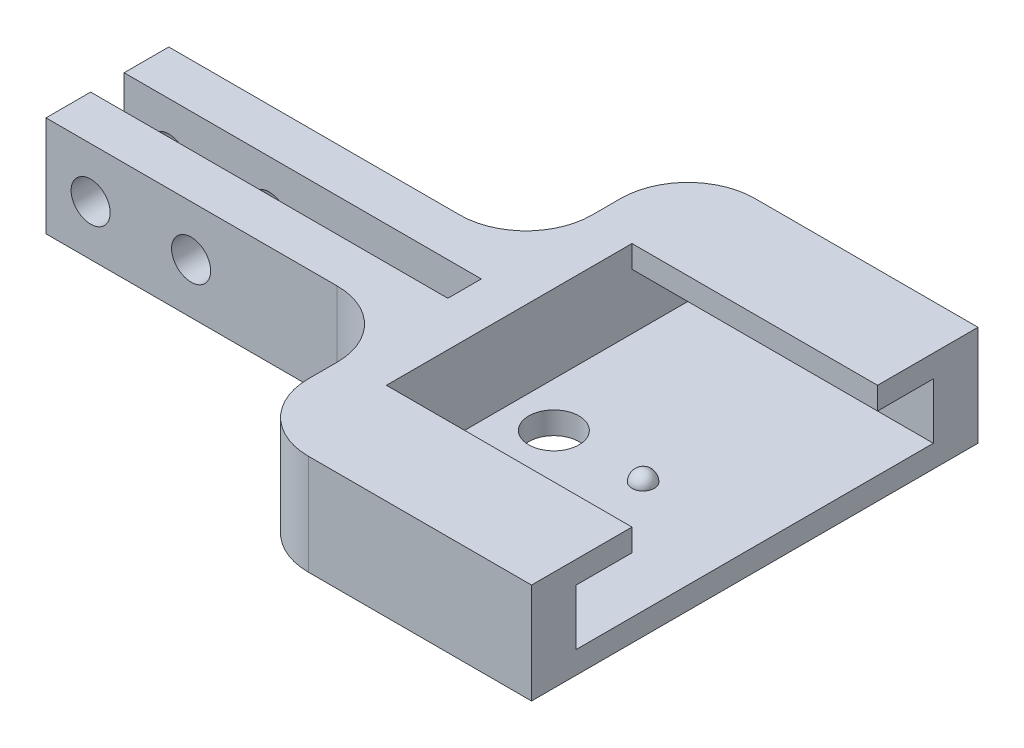
ISO-10303-21;
HEADER;
FILE_DESCRIPTION(('STEP AP214'),'2;1');
FILE_NAME('part.step','',(''),(''),'','','');
FILE_SCHEMA(('AUTOMOTIVE_DESIGN { 1 0 10303 214 1 1 1 1 }'));
ENDSEC;
DATA;
#1=APPLICATION_CONTEXT('core data for automotive mechanical design processes');
#2=APPLICATION_PROTOCOL_DEFINITION('international standard','automotive_design',2000,#1);
#3=PRODUCT_CONTEXT('',#1,'mechanical');
#4=PRODUCT('Part','Part','',(#3));
#5=PRODUCT_RELATED_PRODUCT_CATEGORY('part','',(#4));
#6=PRODUCT_DEFINITION_FORMATION('','',#4);
#7=PRODUCT_DEFINITION_CONTEXT('part definition',#1,'design');
#8=PRODUCT_DEFINITION('design','',#6,#7);
#9=PRODUCT_DEFINITION_SHAPE('','',#8);
#10=(LENGTH_UNIT() NAMED_UNIT(*) SI_UNIT(.MILLI.,.METRE.));
#11=(NAMED_UNIT(*) PLANE_ANGLE_UNIT() SI_UNIT($,.RADIAN.));
#12=(NAMED_UNIT(*) SI_UNIT($,.STERADIAN.) SOLID_ANGLE_UNIT());
#13=UNCERTAINTY_MEASURE_WITH_UNIT(LENGTH_MEASURE(1.E-05),#10,'distance_accuracy_value','');
#14=(GEOMETRIC_REPRESENTATION_CONTEXT(3) GLOBAL_UNCERTAINTY_ASSIGNED_CONTEXT((#13)) GLOBAL_UNIT_ASSIGNED_CONTEXT((#10,
#11,#12)) REPRESENTATION_CONTEXT('',''));
#15=CARTESIAN_POINT('',(0.,0.,0.));
#16=DIRECTION('',(0.,0.,1.));
#17=DIRECTION('',(1.,0.,0.));
#18=AXIS2_PLACEMENT_3D('',#15,#16,#17);
#19=CARTESIAN_POINT('',(5.,4.5,-10.));
#20=DIRECTION('',(-1.,0.,0.));
#21=DIRECTION('',(0.,0.,1.));
#22=AXIS2_PLACEMENT_3D('',#19,#20,#21);
#23=PLANE('',#22);
#24=DIRECTION('',(0.,0.,-1.));
#25=VECTOR('',#24,1.);
#26=CARTESIAN_POINT('',(5.,4.5,-10.));
#27=LINE('',#26,#25);
#28=CARTESIAN_POINT('',(5.,4.5,-5.49999999999997));
#29=VERTEX_POINT('',#28);
#30=CARTESIAN_POINT('',(5.,4.5,-10.));
#31=VERTEX_POINT('',#30);
#32=EDGE_CURVE('E121',#29,#31,#27,.T.);
#33=ORIENTED_EDGE('',*,*,#32,.F.);
#34=DIRECTION('',(0.,1.,0.));
#35=VECTOR('',#34,1.);
#36=CARTESIAN_POINT('',(5.,3.5,-5.49999999999998));
#37=LINE('',#36,#35);
#38=CARTESIAN_POINT('',(5.,3.5,-5.49999999999998));
#39=VERTEX_POINT('',#38);
#40=EDGE_CURVE('E414',#39,#29,#37,.T.);
#41=ORIENTED_EDGE('',*,*,#40,.F.);
#42=DIRECTION('',(0.,0.,1.));
#43=VECTOR('',#42,1.);
#44=CARTESIAN_POINT('',(5.,3.5,-7.99999999999998));
#45=LINE('',#44,#43);
#46=CARTESIAN_POINT('',(5.,3.5,-7.99999999999998));
#47=VERTEX_POINT('',#46);
#48=EDGE_CURVE('E285',#47,#39,#45,.T.);
#49=ORIENTED_EDGE('',*,*,#48,.F.);
#50=DIRECTION('',(0.,1.,0.));
#51=VECTOR('',#50,1.);
#52=CARTESIAN_POINT('',(5.,0.99999999999989,-8.));
#53=LINE('',#52,#51);
#54=CARTESIAN_POINT('',(5.,0.99999999999989,-8.));
#55=VERTEX_POINT('',#54);
#56=EDGE_CURVE('E426',#55,#47,#53,.T.);
#57=ORIENTED_EDGE('',*,*,#56,.F.);
#58=DIRECTION('',(0.,0.,-1.));
#59=VECTOR('',#58,1.);
#60=CARTESIAN_POINT('',(5.,0.99999999999989,8.));
#61=LINE('',#60,#59);
#62=CARTESIAN_POINT('',(5.,0.99999999999989,8.));
#63=VERTEX_POINT('',#62);
#64=EDGE_CURVE('E424',#63,#55,#61,.T.);
#65=ORIENTED_EDGE('',*,*,#64,.F.);
#66=DIRECTION('',(0.,-1.,0.));
#67=VECTOR('',#66,1.);
#68=CARTESIAN_POINT('',(5.,0.99999999999989,8.));
#69=LINE('',#68,#67);
#70=CARTESIAN_POINT('',(5.,3.5,8.));
#71=VERTEX_POINT('',#70);
#72=EDGE_CURVE('E421',#71,#63,#69,.T.);
#73=ORIENTED_EDGE('',*,*,#72,.F.);
#74=DIRECTION('',(0.,0.,1.));
#75=VECTOR('',#74,1.);
#76=CARTESIAN_POINT('',(5.,3.5,8.));
#77=LINE('',#76,#75);
#78=CARTESIAN_POINT('',(5.,3.5,5.5));
#79=VERTEX_POINT('',#78);
#80=EDGE_CURVE('E418',#79,#71,#77,.T.);
#81=ORIENTED_EDGE('',*,*,#80,.F.);
#82=DIRECTION('',(0.,-1.,0.));
#83=VECTOR('',#82,1.);
#84=CARTESIAN_POINT('',(5.,3.5,5.5));
#85=LINE('',#84,#83);
#86=CARTESIAN_POINT('',(5.,4.5,5.5));
#87=VERTEX_POINT('',#86);
#88=EDGE_CURVE('E359',#87,#79,#85,.T.);
#89=ORIENTED_EDGE('',*,*,#88,.F.);
#90=CARTESIAN_POINT('',(5.,4.5,9.99999999999999));
#91=VERTEX_POINT('',#90);
#92=EDGE_CURVE('E316',#91,#87,#27,.T.);
#93=ORIENTED_EDGE('',*,*,#92,.F.);
#94=DIRECTION('',(0.,-1.,0.));
#95=VECTOR('',#94,1.);
#96=CARTESIAN_POINT('',(5.,4.5,9.99999999999999));
#97=LINE('',#96,#95);
#98=CARTESIAN_POINT('',(5.,0.,9.99999999999999));
#99=VERTEX_POINT('',#98);
#100=EDGE_CURVE('E187',#91,#99,#97,.T.);
#101=ORIENTED_EDGE('',*,*,#100,.T.);
#102=DIRECTION('',(0.,0.,-1.));
#103=VECTOR('',#102,1.);
#104=CARTESIAN_POINT('',(5.,0.,-10.));
#105=LINE('',#104,#103);
#106=CARTESIAN_POINT('',(5.,0.,-10.));
#107=VERTEX_POINT('',#106);
#108=EDGE_CURVE('E191',#99,#107,#105,.T.);
#109=ORIENTED_EDGE('',*,*,#108,.T.);
#110=DIRECTION('',(0.,-1.,0.));
#111=VECTOR('',#110,1.);
#112=CARTESIAN_POINT('',(5.,4.5,-10.));
#113=LINE('',#112,#111);
#114=EDGE_CURVE('E40',#31,#107,#113,.T.);
#115=ORIENTED_EDGE('',*,*,#114,.F.);
#116=EDGE_LOOP('',(#33,#41,#49,#57,#65,#73,#81,#89,#93,#101,#109,#115));
#117=FACE_BOUND('',#116,.T.);
#118=ADVANCED_FACE('F33',(#117),#23,.F.);
#119=CARTESIAN_POINT('',(-5.,4.5,-10.));
#120=DIRECTION('',(0.,0.,1.));
#121=DIRECTION('',(1.,0.,0.));
#122=AXIS2_PLACEMENT_3D('',#119,#120,#121);
#123=PLANE('',#122);
#124=DIRECTION('',(-1.,0.,0.));
#125=VECTOR('',#124,1.);
#126=CARTESIAN_POINT('',(-5.,0.,-10.));
#127=LINE('',#126,#125);
#128=CARTESIAN_POINT('',(-5.,0.,-10.));
#129=VERTEX_POINT('',#128);
#130=EDGE_CURVE('E194',#107,#129,#127,.T.);
#131=ORIENTED_EDGE('',*,*,#130,.T.);
#132=DIRECTION('',(0.,-1.,0.));
#133=VECTOR('',#132,1.);
#134=CARTESIAN_POINT('',(-5.,4.5,-10.));
#135=LINE('',#134,#133);
#136=CARTESIAN_POINT('',(-5.,4.5,-10.));
#137=VERTEX_POINT('',#136);
#138=EDGE_CURVE('E256',#137,#129,#135,.T.);
#139=ORIENTED_EDGE('',*,*,#138,.F.);
#140=DIRECTION('',(-1.,0.,0.));
#141=VECTOR('',#140,1.);
#142=CARTESIAN_POINT('',(-5.,4.5,-10.));
#143=LINE('',#142,#141);
#144=EDGE_CURVE('E318',#31,#137,#143,.T.);
#145=ORIENTED_EDGE('',*,*,#144,.F.);
#146=ORIENTED_EDGE('',*,*,#114,.T.);
#147=EDGE_LOOP('',(#131,#139,#145,#146));
#148=FACE_BOUND('',#147,.T.);
#149=ADVANCED_FACE('F463',(#148),#123,.F.);
#150=CARTESIAN_POINT('',(-5.,4.5,-7.00000000000001));
#151=DIRECTION('',(0.,-1.,0.));
#152=DIRECTION('',(0.,0.,-1.));
#153=AXIS2_PLACEMENT_3D('',#150,#151,#152);
#154=CYLINDRICAL_SURFACE('',#153,3.);
#155=CARTESIAN_POINT('',(-5.,0.,-7.00000000000001));
#156=DIRECTION('',(0.,1.,0.));
#157=DIRECTION('',(0.,0.,-1.));
#158=AXIS2_PLACEMENT_3D('',#155,#156,#157);
#159=CIRCLE('',#158,3.);
#160=CARTESIAN_POINT('',(-7.99999999999999,0.,-7.00000000000001));
#161=VERTEX_POINT('',#160);
#162=EDGE_CURVE('E197',#129,#161,#159,.T.);
#163=ORIENTED_EDGE('',*,*,#162,.T.);
#164=DIRECTION('',(0.,-1.,0.));
#165=VECTOR('',#164,1.);
#166=CARTESIAN_POINT('',(-7.99999999999999,4.5,-7.00000000000001));
#167=LINE('',#166,#165);
#168=CARTESIAN_POINT('',(-7.99999999999999,4.5,-7.00000000000001));
#169=VERTEX_POINT('',#168);
#170=EDGE_CURVE('E253',#169,#161,#167,.T.);
#171=ORIENTED_EDGE('',*,*,#170,.F.);
#172=CARTESIAN_POINT('',(-5.,4.5,-7.00000000000001));
#173=DIRECTION('',(0.,1.,0.));
#174=DIRECTION('',(0.,0.,-1.));
#175=AXIS2_PLACEMENT_3D('',#172,#173,#174);
#176=CIRCLE('',#175,3.);
#177=EDGE_CURVE('E320',#137,#169,#176,.T.);
#178=ORIENTED_EDGE('',*,*,#177,.F.);
#179=ORIENTED_EDGE('',*,*,#138,.T.);
#180=EDGE_LOOP('',(#163,#171,#178,#179));
#181=FACE_BOUND('',#180,.T.);
#182=ADVANCED_FACE('F467',(#181),#154,.T.);
#183=CARTESIAN_POINT('',(-7.99999999999999,4.5,-5.70383123525176));
#184=DIRECTION('',(1.,0.,0.));
#185=DIRECTION('',(0.,0.,-1.));
#186=AXIS2_PLACEMENT_3D('',#183,#184,#185);
#187=PLANE('',#186);
#188=DIRECTION('',(0.,0.,1.));
#189=VECTOR('',#188,1.);
#190=CARTESIAN_POINT('',(-7.99999999999999,0.,-5.70383123525176));
#191=LINE('',#190,#189);
#192=CARTESIAN_POINT('',(-7.99999999999999,0.,-5.70383123525176));
#193=VERTEX_POINT('',#192);
#194=EDGE_CURVE('E199',#161,#193,#191,.T.);
#195=ORIENTED_EDGE('',*,*,#194,.T.);
#196=DIRECTION('',(0.,-1.,0.));
#197=VECTOR('',#196,1.);
#198=CARTESIAN_POINT('',(-7.99999999999999,4.5,-5.70383123525176));
#199=LINE('',#198,#197);
#200=CARTESIAN_POINT('',(-7.99999999999999,4.5,-5.70383123525176));
#201=VERTEX_POINT('',#200);
#202=EDGE_CURVE('E250',#201,#193,#199,.T.);
#203=ORIENTED_EDGE('',*,*,#202,.F.);
#204=DIRECTION('',(0.,0.,1.));
#205=VECTOR('',#204,1.);
#206=CARTESIAN_POINT('',(-7.99999999999999,4.5,-5.70383123525176));
#207=LINE('',#206,#205);
#208=EDGE_CURVE('E322',#169,#201,#207,.T.);
#209=ORIENTED_EDGE('',*,*,#208,.F.);
#210=ORIENTED_EDGE('',*,*,#170,.T.);
#211=EDGE_LOOP('',(#195,#203,#209,#210));
#212=FACE_BOUND('',#211,.T.);
#213=ADVANCED_FACE('F472',(#212),#187,.F.);
#214=CARTESIAN_POINT('',(-10.9538312352413,4.5,-5.70383123525176));
#215=DIRECTION('',(0.,-1.,0.));
#216=DIRECTION('',(0.,0.,-1.));
#217=AXIS2_PLACEMENT_3D('',#214,#215,#216);
#218=CYLINDRICAL_SURFACE('',#217,2.95383123524653);
#219=CARTESIAN_POINT('',(-10.9538312352413,0.,-5.70383123525176));
#220=DIRECTION('',(0.,-1.,0.));
#221=DIRECTION('',(0.,0.,-1.));
#222=AXIS2_PLACEMENT_3D('',#219,#220,#221);
#223=CIRCLE('',#222,2.95383123524653);
#224=CARTESIAN_POINT('',(-10.9538312352413,0.,-2.75000000000523));
#225=VERTEX_POINT('',#224);
#226=EDGE_CURVE('E201',#193,#225,#223,.T.);
#227=ORIENTED_EDGE('',*,*,#226,.T.);
#228=DIRECTION('',(0.,-1.,0.));
#229=VECTOR('',#228,1.);
#230=CARTESIAN_POINT('',(-10.9538312352413,4.5,-2.75000000000523));
#231=LINE('',#230,#229);
#232=CARTESIAN_POINT('',(-10.9538312352413,4.5,-2.75000000000523));
#233=VERTEX_POINT('',#232);
#234=EDGE_CURVE('E247',#233,#225,#231,.T.);
#235=ORIENTED_EDGE('',*,*,#234,.F.);
#236=CARTESIAN_POINT('',(-10.9538312352413,4.5,-5.70383123525176));
#237=DIRECTION('',(0.,-1.,0.));
#238=DIRECTION('',(0.,0.,-1.));
#239=AXIS2_PLACEMENT_3D('',#236,#237,#238);
#240=CIRCLE('',#239,2.95383123524653);
#241=EDGE_CURVE('E324',#201,#233,#240,.T.);
#242=ORIENTED_EDGE('',*,*,#241,.F.);
#243=ORIENTED_EDGE('',*,*,#202,.T.);
#244=EDGE_LOOP('',(#227,#235,#242,#243));
#245=FACE_BOUND('',#244,.T.);
#246=ADVANCED_FACE('F478',(#245),#218,.F.);
#247=CARTESIAN_POINT('',(-24.,4.5,-2.75));
#248=DIRECTION('',(0.,0.,1.));
#249=DIRECTION('',(1.,0.,0.));
#250=AXIS2_PLACEMENT_3D('',#247,#248,#249);
#251=PLANE('',#250);
#252=CARTESIAN_POINT('',(-17.5,2.25,-2.75));
#253=DIRECTION('',(0.,0.,1.));
#254=DIRECTION('',(1.,0.,0.));
#255=AXIS2_PLACEMENT_3D('',#252,#253,#254);
#256=CIRCLE('',#255,0.875000000000002);
#257=CARTESIAN_POINT('',(-16.625,2.25,-2.75));
#258=VERTEX_POINT('',#257);
#259=EDGE_CURVE('E264',#258,#258,#256,.F.);
#260=ORIENTED_EDGE('',*,*,#259,.F.);
#261=EDGE_LOOP('',(#260));
#262=FACE_BOUND('',#261,.T.);
#263=CARTESIAN_POINT('',(-22.,2.25,-2.75));
#264=DIRECTION('',(0.,0.,1.));
#265=DIRECTION('',(1.,0.,0.));
#266=AXIS2_PLACEMENT_3D('',#263,#264,#265);
#267=CIRCLE('',#266,0.875000000000002);
#268=CARTESIAN_POINT('',(-21.125,2.25,-2.75));
#269=VERTEX_POINT('',#268);
#270=EDGE_CURVE('E195',#269,#269,#267,.F.);
#271=ORIENTED_EDGE('',*,*,#270,.F.);
#272=EDGE_LOOP('',(#271));
#273=FACE_BOUND('',#272,.T.);
#274=DIRECTION('',(-1.,0.,0.));
#275=VECTOR('',#274,1.);
#276=CARTESIAN_POINT('',(-24.,0.,-2.75));
#277=LINE('',#276,#275);
#278=CARTESIAN_POINT('',(-24.,0.,-2.75));
#279=VERTEX_POINT('',#278);
#280=EDGE_CURVE('E203',#225,#279,#277,.T.);
#281=ORIENTED_EDGE('',*,*,#280,.T.);
#282=DIRECTION('',(0.,-1.,0.));
#283=VECTOR('',#282,1.);
#284=CARTESIAN_POINT('',(-24.,4.5,-2.75));
#285=LINE('',#284,#283);
#286=CARTESIAN_POINT('',(-24.,4.5,-2.75));
#287=VERTEX_POINT('',#286);
#288=EDGE_CURVE('E244',#287,#279,#285,.T.);
#289=ORIENTED_EDGE('',*,*,#288,.F.);
#290=DIRECTION('',(-1.,0.,0.));
#291=VECTOR('',#290,1.);
#292=CARTESIAN_POINT('',(-24.,4.5,-2.75));
#293=LINE('',#292,#291);
#294=EDGE_CURVE('E326',#233,#287,#293,.T.);
#295=ORIENTED_EDGE('',*,*,#294,.F.);
#296=ORIENTED_EDGE('',*,*,#234,.T.);
#297=EDGE_LOOP('',(#281,#289,#295,#296));
#298=FACE_BOUND('',#297,.T.);
#299=ADVANCED_FACE('F482',(#262,#273,#298),#251,.F.);
#300=CARTESIAN_POINT('',(-24.,4.5,-0.75));
#301=DIRECTION('',(1.,0.,0.));
#302=DIRECTION('',(0.,0.,-1.));
#303=AXIS2_PLACEMENT_3D('',#300,#301,#302);
#304=PLANE('',#303);
#305=DIRECTION('',(0.,0.,1.));
#306=VECTOR('',#305,1.);
#307=CARTESIAN_POINT('',(-24.,0.,-0.75));
#308=LINE('',#307,#306);
#309=CARTESIAN_POINT('',(-24.,0.,-0.75));
#310=VERTEX_POINT('',#309);
#311=EDGE_CURVE('E205',#279,#310,#308,.T.);
#312=ORIENTED_EDGE('',*,*,#311,.T.);
#313=DIRECTION('',(0.,-1.,0.));
#314=VECTOR('',#313,1.);
#315=CARTESIAN_POINT('',(-24.,4.5,-0.75));
#316=LINE('',#315,#314);
#317=CARTESIAN_POINT('',(-24.,4.5,-0.75));
#318=VERTEX_POINT('',#317);
#319=EDGE_CURVE('E241',#318,#310,#316,.T.);
#320=ORIENTED_EDGE('',*,*,#319,.F.);
#321=DIRECTION('',(0.,0.,1.));
#322=VECTOR('',#321,1.);
#323=CARTESIAN_POINT('',(-24.,4.5,-0.75));
#324=LINE('',#323,#322);
#325=EDGE_CURVE('E328',#287,#318,#324,.T.);
#326=ORIENTED_EDGE('',*,*,#325,.F.);
#327=ORIENTED_EDGE('',*,*,#288,.T.);
#328=EDGE_LOOP('',(#312,#320,#326,#327));
#329=FACE_BOUND('',#328,.T.);
#330=ADVANCED_FACE('F486',(#329),#304,.F.);
#331=CARTESIAN_POINT('',(-24.,4.5,-0.75));
#332=DIRECTION('',(0.,0.,-1.));
#333=DIRECTION('',(-1.,0.,0.));
#334=AXIS2_PLACEMENT_3D('',#331,#332,#333);
#335=PLANE('',#334);
#336=CARTESIAN_POINT('',(-17.5,2.25,-0.750000000000013));
#337=DIRECTION('',(0.,0.,-1.));
#338=DIRECTION('',(-1.,0.,0.));
#339=AXIS2_PLACEMENT_3D('',#336,#337,#338);
#340=CIRCLE('',#339,0.875000000000002);
#341=CARTESIAN_POINT('',(-18.375,2.25,-0.750000000000011));
#342=VERTEX_POINT('',#341);
#343=EDGE_CURVE('E272',#342,#342,#340,.F.);
#344=ORIENTED_EDGE('',*,*,#343,.F.);
#345=EDGE_LOOP('',(#344));
#346=FACE_BOUND('',#345,.T.);
#347=CARTESIAN_POINT('',(-22.,2.25,-0.750000000000004));
#348=DIRECTION('',(0.,0.,-1.));
#349=DIRECTION('',(-1.,0.,0.));
#350=AXIS2_PLACEMENT_3D('',#347,#348,#349);
#351=CIRCLE('',#350,0.875000000000002);
#352=CARTESIAN_POINT('',(-22.875,2.25,-0.750000000000003));
#353=VERTEX_POINT('',#352);
#354=EDGE_CURVE('E311',#353,#353,#351,.F.);
#355=ORIENTED_EDGE('',*,*,#354,.F.);
#356=EDGE_LOOP('',(#355));
#357=FACE_BOUND('',#356,.T.);
#358=DIRECTION('',(1.,0.,0.));
#359=VECTOR('',#358,1.);
#360=CARTESIAN_POINT('',(-24.,0.,-0.75));
#361=LINE('',#360,#359);
#362=CARTESIAN_POINT('',(-8.,0.,-0.750000000000028));
#363=VERTEX_POINT('',#362);
#364=EDGE_CURVE('E207',#310,#363,#361,.T.);
#365=ORIENTED_EDGE('',*,*,#364,.T.);
#366=DIRECTION('',(0.,-1.,0.));
#367=VECTOR('',#366,1.);
#368=CARTESIAN_POINT('',(-8.,4.5,-0.750000000000028));
#369=LINE('',#368,#367);
#370=CARTESIAN_POINT('',(-8.,4.5,-0.750000000000028));
#371=VERTEX_POINT('',#370);
#372=EDGE_CURVE('E238',#371,#363,#369,.T.);
#373=ORIENTED_EDGE('',*,*,#372,.F.);
#374=DIRECTION('',(1.,0.,0.));
#375=VECTOR('',#374,1.);
#376=CARTESIAN_POINT('',(-24.,4.5,-0.75));
#377=LINE('',#376,#375);
#378=EDGE_CURVE('E330',#318,#371,#377,.T.);
#379=ORIENTED_EDGE('',*,*,#378,.F.);
#380=ORIENTED_EDGE('',*,*,#319,.T.);
#381=EDGE_LOOP('',(#365,#373,#379,#380));
#382=FACE_BOUND('',#381,.T.);
#383=ADVANCED_FACE('F490',(#346,#357,#382),#335,.F.);
#384=CARTESIAN_POINT('',(-8.,4.5,-0.750000000000028));
#385=DIRECTION('',(1.,0.,0.));
#386=DIRECTION('',(0.,0.,-1.));
#387=AXIS2_PLACEMENT_3D('',#384,#385,#386);
#388=PLANE('',#387);
#389=DIRECTION('',(0.,0.,1.));
#390=VECTOR('',#389,1.);
#391=CARTESIAN_POINT('',(-8.,0.,-0.750000000000028));
#392=LINE('',#391,#390);
#393=CARTESIAN_POINT('',(-8.,0.,0.750000000000028));
#394=VERTEX_POINT('',#393);
#395=EDGE_CURVE('E209',#363,#394,#392,.T.);
#396=ORIENTED_EDGE('',*,*,#395,.T.);
#397=DIRECTION('',(0.,-1.,0.));
#398=VECTOR('',#397,1.);
#399=CARTESIAN_POINT('',(-8.,4.5,0.750000000000028));
#400=LINE('',#399,#398);
#401=CARTESIAN_POINT('',(-8.,4.5,0.750000000000028));
#402=VERTEX_POINT('',#401);
#403=EDGE_CURVE('E235',#402,#394,#400,.T.);
#404=ORIENTED_EDGE('',*,*,#403,.F.);
#405=DIRECTION('',(0.,0.,1.));
#406=VECTOR('',#405,1.);
#407=CARTESIAN_POINT('',(-8.,4.5,-0.750000000000028));
#408=LINE('',#407,#406);
#409=EDGE_CURVE('E332',#371,#402,#408,.T.);
#410=ORIENTED_EDGE('',*,*,#409,.F.);
#411=ORIENTED_EDGE('',*,*,#372,.T.);
#412=EDGE_LOOP('',(#396,#404,#410,#411));
#413=FACE_BOUND('',#412,.T.);
#414=ADVANCED_FACE('F494',(#413),#388,.F.);
#415=CARTESIAN_POINT('',(-8.,4.5,0.750000000000028));
#416=DIRECTION('',(0.,0.,1.));
#417=DIRECTION('',(1.,0.,0.));
#418=AXIS2_PLACEMENT_3D('',#415,#416,#417);
#419=PLANE('',#418);
#420=CARTESIAN_POINT('',(-17.5,2.25,0.750000000000011));
#421=DIRECTION('',(0.,0.,1.));
#422=DIRECTION('',(1.,0.,0.));
#423=AXIS2_PLACEMENT_3D('',#420,#421,#422);
#424=CIRCLE('',#423,0.875000000000002);
#425=CARTESIAN_POINT('',(-16.625,2.25,0.750000000000013));
#426=VERTEX_POINT('',#425);
#427=EDGE_CURVE('E267',#426,#426,#424,.F.);
#428=ORIENTED_EDGE('',*,*,#427,.F.);
#429=EDGE_LOOP('',(#428));
#430=FACE_BOUND('',#429,.T.);
#431=CARTESIAN_POINT('',(-22.,2.25,0.750000000000004));
#432=DIRECTION('',(0.,0.,1.));
#433=DIRECTION('',(1.,0.,0.));
#434=AXIS2_PLACEMENT_3D('',#431,#432,#433);
#435=CIRCLE('',#434,0.875000000000002);
#436=CARTESIAN_POINT('',(-21.125,2.25,0.750000000000006));
#437=VERTEX_POINT('',#436);
#438=EDGE_CURVE('E263',#437,#437,#435,.F.);
#439=ORIENTED_EDGE('',*,*,#438,.F.);
#440=EDGE_LOOP('',(#439));
#441=FACE_BOUND('',#440,.T.);
#442=DIRECTION('',(-1.,0.,0.));
#443=VECTOR('',#442,1.);
#444=CARTESIAN_POINT('',(-8.,0.,0.750000000000028));
#445=LINE('',#444,#443);
#446=CARTESIAN_POINT('',(-24.,0.,0.75));
#447=VERTEX_POINT('',#446);
#448=EDGE_CURVE('E211',#394,#447,#445,.T.);
#449=ORIENTED_EDGE('',*,*,#448,.T.);
#450=DIRECTION('',(0.,-1.,0.));
#451=VECTOR('',#450,1.);
#452=CARTESIAN_POINT('',(-24.,4.5,0.75));
#453=LINE('',#452,#451);
#454=CARTESIAN_POINT('',(-24.,4.5,0.75));
#455=VERTEX_POINT('',#454);
#456=EDGE_CURVE('E232',#455,#447,#453,.T.);
#457=ORIENTED_EDGE('',*,*,#456,.F.);
#458=DIRECTION('',(-1.,0.,0.));
#459=VECTOR('',#458,1.);
#460=CARTESIAN_POINT('',(-8.,4.5,0.750000000000028));
#461=LINE('',#460,#459);
#462=EDGE_CURVE('E334',#402,#455,#461,.T.);
#463=ORIENTED_EDGE('',*,*,#462,.F.);
#464=ORIENTED_EDGE('',*,*,#403,.T.);
#465=EDGE_LOOP('',(#449,#457,#463,#464));
#466=FACE_BOUND('',#465,.T.);
#467=ADVANCED_FACE('F498',(#430,#441,#466),#419,.F.);
#468=CARTESIAN_POINT('',(-24.,4.5,0.75));
#469=DIRECTION('',(1.,0.,0.));
#470=DIRECTION('',(0.,0.,-1.));
#471=AXIS2_PLACEMENT_3D('',#468,#469,#470);
#472=PLANE('',#471);
#473=DIRECTION('',(0.,0.,1.));
#474=VECTOR('',#473,1.);
#475=CARTESIAN_POINT('',(-24.,0.,0.75));
#476=LINE('',#475,#474);
#477=CARTESIAN_POINT('',(-24.,0.,2.75));
#478=VERTEX_POINT('',#477);
#479=EDGE_CURVE('E213',#447,#478,#476,.T.);
#480=ORIENTED_EDGE('',*,*,#479,.T.);
#481=DIRECTION('',(0.,-1.,0.));
#482=VECTOR('',#481,1.);
#483=CARTESIAN_POINT('',(-24.,4.5,2.75));
#484=LINE('',#483,#482);
#485=CARTESIAN_POINT('',(-24.,4.5,2.75));
#486=VERTEX_POINT('',#485);
#487=EDGE_CURVE('E229',#486,#478,#484,.T.);
#488=ORIENTED_EDGE('',*,*,#487,.F.);
#489=DIRECTION('',(0.,0.,1.));
#490=VECTOR('',#489,1.);
#491=CARTESIAN_POINT('',(-24.,4.5,0.75));
#492=LINE('',#491,#490);
#493=EDGE_CURVE('E336',#455,#486,#492,.T.);
#494=ORIENTED_EDGE('',*,*,#493,.F.);
#495=ORIENTED_EDGE('',*,*,#456,.T.);
#496=EDGE_LOOP('',(#480,#488,#494,#495));
#497=FACE_BOUND('',#496,.T.);
#498=ADVANCED_FACE('F502',(#497),#472,.F.);
#499=CARTESIAN_POINT('',(-24.,4.5,2.75));
#500=DIRECTION('',(0.,0.,-1.));
#501=DIRECTION('',(-1.,0.,0.));
#502=AXIS2_PLACEMENT_3D('',#499,#500,#501);
#503=PLANE('',#502);
#504=CARTESIAN_POINT('',(-17.5,2.25,2.75));
#505=DIRECTION('',(0.,0.,-1.));
#506=DIRECTION('',(-1.,0.,0.));
#507=AXIS2_PLACEMENT_3D('',#504,#505,#506);
#508=CIRCLE('',#507,0.875000000000002);
#509=CARTESIAN_POINT('',(-18.375,2.25,2.75));
#510=VERTEX_POINT('',#509);
#511=EDGE_CURVE('E265',#510,#510,#508,.F.);
#512=ORIENTED_EDGE('',*,*,#511,.F.);
#513=EDGE_LOOP('',(#512));
#514=FACE_BOUND('',#513,.T.);
#515=CARTESIAN_POINT('',(-22.,2.25,2.75));
#516=DIRECTION('',(0.,0.,-1.));
#517=DIRECTION('',(-1.,0.,0.));
#518=AXIS2_PLACEMENT_3D('',#515,#516,#517);
#519=CIRCLE('',#518,0.875000000000002);
#520=CARTESIAN_POINT('',(-22.875,2.25,2.75));
#521=VERTEX_POINT('',#520);
#522=EDGE_CURVE('E261',#521,#521,#519,.F.);
#523=ORIENTED_EDGE('',*,*,#522,.F.);
#524=EDGE_LOOP('',(#523));
#525=FACE_BOUND('',#524,.T.);
#526=DIRECTION('',(1.,0.,0.));
#527=VECTOR('',#526,1.);
#528=CARTESIAN_POINT('',(-24.,0.,2.75));
#529=LINE('',#528,#527);
#530=CARTESIAN_POINT('',(-10.9538312352413,0.,2.75));
#531=VERTEX_POINT('',#530);
#532=EDGE_CURVE('E215',#478,#531,#529,.T.);
#533=ORIENTED_EDGE('',*,*,#532,.T.);
#534=DIRECTION('',(0.,-1.,0.));
#535=VECTOR('',#534,1.);
#536=CARTESIAN_POINT('',(-10.9538312352413,4.5,2.75));
#537=LINE('',#536,#535);
#538=CARTESIAN_POINT('',(-10.9538312352413,4.5,2.75));
#539=VERTEX_POINT('',#538);
#540=EDGE_CURVE('E226',#539,#531,#537,.T.);
#541=ORIENTED_EDGE('',*,*,#540,.F.);
#542=DIRECTION('',(1.,0.,0.));
#543=VECTOR('',#542,1.);
#544=CARTESIAN_POINT('',(-24.,4.5,2.75));
#545=LINE('',#544,#543);
#546=EDGE_CURVE('E338',#486,#539,#545,.T.);
#547=ORIENTED_EDGE('',*,*,#546,.F.);
#548=ORIENTED_EDGE('',*,*,#487,.T.);
#549=EDGE_LOOP('',(#533,#541,#547,#548));
#550=FACE_BOUND('',#549,.T.);
#551=ADVANCED_FACE('F344',(#514,#525,#550),#503,.F.);
#552=CARTESIAN_POINT('',(-10.9538312352413,4.5,5.70383123525176));
#553=DIRECTION('',(0.,-1.,0.));
#554=DIRECTION('',(0.,0.,-1.));
#555=AXIS2_PLACEMENT_3D('',#552,#553,#554);
#556=CYLINDRICAL_SURFACE('',#555,2.95383123524653);
#557=CARTESIAN_POINT('',(-10.9538312352413,0.,5.70383123525176));
#558=DIRECTION('',(0.,-1.,0.));
#559=DIRECTION('',(0.,0.,1.));
#560=AXIS2_PLACEMENT_3D('',#557,#558,#559);
#561=CIRCLE('',#560,2.95383123524653);
#562=CARTESIAN_POINT('',(-7.99999999999477,0.,5.70383123525176));
#563=VERTEX_POINT('',#562);
#564=EDGE_CURVE('E217',#531,#563,#561,.T.);
#565=ORIENTED_EDGE('',*,*,#564,.T.);
#566=DIRECTION('',(0.,-1.,0.));
#567=VECTOR('',#566,1.);
#568=CARTESIAN_POINT('',(-7.99999999999477,4.5,5.70383123525176));
#569=LINE('',#568,#567);
#570=CARTESIAN_POINT('',(-7.99999999999477,4.5,5.70383123525176));
#571=VERTEX_POINT('',#570);
#572=EDGE_CURVE('E182',#571,#563,#569,.T.);
#573=ORIENTED_EDGE('',*,*,#572,.F.);
#574=CARTESIAN_POINT('',(-10.9538312352413,4.5,5.70383123525176));
#575=DIRECTION('',(0.,-1.,0.));
#576=DIRECTION('',(0.,0.,1.));
#577=AXIS2_PLACEMENT_3D('',#574,#575,#576);
#578=CIRCLE('',#577,2.95383123524653);
#579=EDGE_CURVE('E170',#539,#571,#578,.T.);
#580=ORIENTED_EDGE('',*,*,#579,.F.);
#581=ORIENTED_EDGE('',*,*,#540,.T.);
#582=EDGE_LOOP('',(#565,#573,#580,#581));
#583=FACE_BOUND('',#582,.T.);
#584=ADVANCED_FACE('F348',(#583),#556,.F.);
#585=CARTESIAN_POINT('',(-7.99999999999999,4.5,5.70383123525176));
#586=DIRECTION('',(1.,0.,0.));
#587=DIRECTION('',(0.,0.,-1.));
#588=AXIS2_PLACEMENT_3D('',#585,#586,#587);
#589=PLANE('',#588);
#590=DIRECTION('',(0.,0.,1.));
#591=VECTOR('',#590,1.);
#592=CARTESIAN_POINT('',(-7.99999999999999,0.,5.70383123525176));
#593=LINE('',#592,#591);
#594=CARTESIAN_POINT('',(-7.99999999999999,0.,7.00000000000001));
#595=VERTEX_POINT('',#594);
#596=EDGE_CURVE('E179',#563,#595,#593,.T.);
#597=ORIENTED_EDGE('',*,*,#596,.T.);
#598=DIRECTION('',(0.,-1.,0.));
#599=VECTOR('',#598,1.);
#600=CARTESIAN_POINT('',(-7.99999999999999,4.5,7.00000000000001));
#601=LINE('',#600,#599);
#602=CARTESIAN_POINT('',(-7.99999999999999,4.5,7.00000000000001));
#603=VERTEX_POINT('',#602);
#604=EDGE_CURVE('E176',#603,#595,#601,.T.);
#605=ORIENTED_EDGE('',*,*,#604,.F.);
#606=DIRECTION('',(0.,0.,1.));
#607=VECTOR('',#606,1.);
#608=CARTESIAN_POINT('',(-7.99999999999999,4.5,5.70383123525176));
#609=LINE('',#608,#607);
#610=EDGE_CURVE('E162',#571,#603,#609,.T.);
#611=ORIENTED_EDGE('',*,*,#610,.F.);
#612=ORIENTED_EDGE('',*,*,#572,.T.);
#613=EDGE_LOOP('',(#597,#605,#611,#612));
#614=FACE_BOUND('',#613,.T.);
#615=ADVANCED_FACE('F177',(#614),#589,.F.);
#616=CARTESIAN_POINT('',(-5.,4.5,7.));
#617=DIRECTION('',(0.,-1.,0.));
#618=DIRECTION('',(0.,0.,-1.));
#619=AXIS2_PLACEMENT_3D('',#616,#617,#618);
#620=CYLINDRICAL_SURFACE('',#619,3.);
#621=CARTESIAN_POINT('',(-5.,0.,7.));
#622=DIRECTION('',(0.,1.,0.));
#623=DIRECTION('',(0.,0.,-1.));
#624=AXIS2_PLACEMENT_3D('',#621,#622,#623);
#625=CIRCLE('',#624,3.);
#626=CARTESIAN_POINT('',(-5.,0.,9.99999999999999));
#627=VERTEX_POINT('',#626);
#628=EDGE_CURVE('E220',#595,#627,#625,.T.);
#629=ORIENTED_EDGE('',*,*,#628,.T.);
#630=DIRECTION('',(0.,-1.,0.));
#631=VECTOR('',#630,1.);
#632=CARTESIAN_POINT('',(-5.,4.5,9.99999999999999));
#633=LINE('',#632,#631);
#634=CARTESIAN_POINT('',(-5.,4.5,9.99999999999999));
#635=VERTEX_POINT('',#634);
#636=EDGE_CURVE('E183',#635,#627,#633,.T.);
#637=ORIENTED_EDGE('',*,*,#636,.F.);
#638=CARTESIAN_POINT('',(-5.,4.5,7.));
#639=DIRECTION('',(0.,1.,0.));
#640=DIRECTION('',(0.,0.,-1.));
#641=AXIS2_PLACEMENT_3D('',#638,#639,#640);
#642=CIRCLE('',#641,3.);
#643=EDGE_CURVE('E167',#603,#635,#642,.T.);
#644=ORIENTED_EDGE('',*,*,#643,.F.);
#645=ORIENTED_EDGE('',*,*,#604,.T.);
#646=EDGE_LOOP('',(#629,#637,#644,#645));
#647=FACE_BOUND('',#646,.T.);
#648=ADVANCED_FACE('F185',(#647),#620,.T.);
#649=CARTESIAN_POINT('',(-5.,4.5,9.99999999999999));
#650=DIRECTION('',(0.,0.,-1.));
#651=DIRECTION('',(-1.,0.,0.));
#652=AXIS2_PLACEMENT_3D('',#649,#650,#651);
#653=PLANE('',#652);
#654=DIRECTION('',(1.,0.,0.));
#655=VECTOR('',#654,1.);
#656=CARTESIAN_POINT('',(-5.,0.,9.99999999999999));
#657=LINE('',#656,#655);
#658=EDGE_CURVE('E113',#627,#99,#657,.T.);
#659=ORIENTED_EDGE('',*,*,#658,.T.);
#660=ORIENTED_EDGE('',*,*,#100,.F.);
#661=DIRECTION('',(1.,0.,0.));
#662=VECTOR('',#661,1.);
#663=CARTESIAN_POINT('',(-5.,4.5,9.99999999999999));
#664=LINE('',#663,#662);
#665=EDGE_CURVE('E56',#635,#91,#664,.T.);
#666=ORIENTED_EDGE('',*,*,#665,.F.);
#667=ORIENTED_EDGE('',*,*,#636,.T.);
#668=EDGE_LOOP('',(#659,#660,#666,#667));
#669=FACE_BOUND('',#668,.T.);
#670=ADVANCED_FACE('F352',(#669),#653,.F.);
#671=CARTESIAN_POINT('',(-5.,4.5,7.));
#672=DIRECTION('',(0.,-1.,0.));
#673=DIRECTION('',(0.,0.,-1.));
#674=AXIS2_PLACEMENT_3D('',#671,#672,#673);
#675=PLANE('',#674);
#676=DIRECTION('',(0.,0.,1.));
#677=VECTOR('',#676,1.);
#678=CARTESIAN_POINT('',(-6.,4.5,5.5));
#679=LINE('',#678,#677);
#680=CARTESIAN_POINT('',(-6.,4.5,-5.49999999999997));
#681=VERTEX_POINT('',#680);
#682=CARTESIAN_POINT('',(-6.,4.5,5.5));
#683=VERTEX_POINT('',#682);
#684=EDGE_CURVE('E402',#681,#683,#679,.T.);
#685=ORIENTED_EDGE('',*,*,#684,.F.);
#686=DIRECTION('',(1.,0.,0.));
#687=VECTOR('',#686,1.);
#688=CARTESIAN_POINT('',(-6.,4.5,-5.49999999999997));
#689=LINE('',#688,#687);
#690=EDGE_CURVE('E302',#681,#29,#689,.T.);
#691=ORIENTED_EDGE('',*,*,#690,.T.);
#692=ORIENTED_EDGE('',*,*,#32,.T.);
#693=ORIENTED_EDGE('',*,*,#144,.T.);
#694=ORIENTED_EDGE('',*,*,#177,.T.);
#695=ORIENTED_EDGE('',*,*,#208,.T.);
#696=ORIENTED_EDGE('',*,*,#241,.T.);
#697=ORIENTED_EDGE('',*,*,#294,.T.);
#698=ORIENTED_EDGE('',*,*,#325,.T.);
#699=ORIENTED_EDGE('',*,*,#378,.T.);
#700=ORIENTED_EDGE('',*,*,#409,.T.);
#701=ORIENTED_EDGE('',*,*,#462,.T.);
#702=ORIENTED_EDGE('',*,*,#493,.T.);
#703=ORIENTED_EDGE('',*,*,#546,.T.);
#704=ORIENTED_EDGE('',*,*,#579,.T.);
#705=ORIENTED_EDGE('',*,*,#610,.T.);
#706=ORIENTED_EDGE('',*,*,#643,.T.);
#707=ORIENTED_EDGE('',*,*,#665,.T.);
#708=ORIENTED_EDGE('',*,*,#92,.T.);
#709=DIRECTION('',(1.,0.,0.));
#710=VECTOR('',#709,1.);
#711=CARTESIAN_POINT('',(-6.,4.5,5.5));
#712=LINE('',#711,#710);
#713=EDGE_CURVE('E299',#683,#87,#712,.T.);
#714=ORIENTED_EDGE('',*,*,#713,.F.);
#715=EDGE_LOOP('',(#685,#691,#692,#693,#694,#695,#696,#697,#698,#699,#700,#701,#702,#703,#704,
#705,#706,#707,#708,#714));
#716=FACE_BOUND('',#715,.T.);
#717=ADVANCED_FACE('F165',(#716),#675,.F.);
#718=CARTESIAN_POINT('',(-5.,0.,7.));
#719=DIRECTION('',(0.,-1.,0.));
#720=DIRECTION('',(0.,0.,-1.));
#721=AXIS2_PLACEMENT_3D('',#718,#719,#720);
#722=PLANE('',#721);
#723=CARTESIAN_POINT('',(-4.,0.,0.));
#724=DIRECTION('',(0.,1.,0.));
#725=DIRECTION('',(0.,0.,1.));
#726=AXIS2_PLACEMENT_3D('',#723,#724,#725);
#727=CIRCLE('',#726,1.125);
#728=CARTESIAN_POINT('',(-4.,0.,1.125));
#729=VERTEX_POINT('',#728);
#730=EDGE_CURVE('E416',#729,#729,#727,.T.);
#731=ORIENTED_EDGE('',*,*,#730,.T.);
#732=EDGE_LOOP('',(#731));
#733=FACE_BOUND('',#732,.T.);
#734=ORIENTED_EDGE('',*,*,#108,.F.);
#735=ORIENTED_EDGE('',*,*,#658,.F.);
#736=ORIENTED_EDGE('',*,*,#628,.F.);
#737=ORIENTED_EDGE('',*,*,#596,.F.);
#738=ORIENTED_EDGE('',*,*,#564,.F.);
#739=ORIENTED_EDGE('',*,*,#532,.F.);
#740=ORIENTED_EDGE('',*,*,#479,.F.);
#741=ORIENTED_EDGE('',*,*,#448,.F.);
#742=ORIENTED_EDGE('',*,*,#395,.F.);
#743=ORIENTED_EDGE('',*,*,#364,.F.);
#744=ORIENTED_EDGE('',*,*,#311,.F.);
#745=ORIENTED_EDGE('',*,*,#280,.F.);
#746=ORIENTED_EDGE('',*,*,#226,.F.);
#747=ORIENTED_EDGE('',*,*,#194,.F.);
#748=ORIENTED_EDGE('',*,*,#162,.F.);
#749=ORIENTED_EDGE('',*,*,#130,.F.);
#750=EDGE_LOOP('',(#734,#735,#736,#737,#738,#739,#740,#741,#742,#743,#744,#745,#746,#747,#748,#749));
#751=FACE_BOUND('',#750,.T.);
#752=ADVANCED_FACE('F351',(#733,#751),#722,.T.);
#753=CARTESIAN_POINT('',(-22.,2.25,12.75));
#754=DIRECTION('',(0.,0.,-1.));
#755=DIRECTION('',(-1.,0.,0.));
#756=AXIS2_PLACEMENT_3D('',#753,#754,#755);
#757=CYLINDRICAL_SURFACE('',#756,0.875000000000002);
#758=ORIENTED_EDGE('',*,*,#522,.T.);
#759=EDGE_LOOP('',(#758));
#760=FACE_BOUND('',#759,.T.);
#761=ORIENTED_EDGE('',*,*,#438,.T.);
#762=EDGE_LOOP('',(#761));
#763=FACE_BOUND('',#762,.T.);
#764=ADVANCED_FACE('F520',(#760,#763),#757,.F.);
#765=ORIENTED_EDGE('',*,*,#354,.T.);
#766=EDGE_LOOP('',(#765));
#767=FACE_BOUND('',#766,.T.);
#768=ORIENTED_EDGE('',*,*,#270,.T.);
#769=EDGE_LOOP('',(#768));
#770=FACE_BOUND('',#769,.T.);
#771=ADVANCED_FACE('F524',(#767,#770),#757,.F.);
#772=CARTESIAN_POINT('',(-17.5,2.25,12.75));
#773=DIRECTION('',(0.,0.,-1.));
#774=DIRECTION('',(-1.,0.,0.));
#775=AXIS2_PLACEMENT_3D('',#772,#773,#774);
#776=CYLINDRICAL_SURFACE('',#775,0.875000000000002);
#777=ORIENTED_EDGE('',*,*,#511,.T.);
#778=EDGE_LOOP('',(#777));
#779=FACE_BOUND('',#778,.T.);
#780=ORIENTED_EDGE('',*,*,#427,.T.);
#781=EDGE_LOOP('',(#780));
#782=FACE_BOUND('',#781,.T.);
#783=ADVANCED_FACE('F527',(#779,#782),#776,.F.);
#784=ORIENTED_EDGE('',*,*,#343,.T.);
#785=EDGE_LOOP('',(#784));
#786=FACE_BOUND('',#785,.T.);
#787=ORIENTED_EDGE('',*,*,#259,.T.);
#788=EDGE_LOOP('',(#787));
#789=FACE_BOUND('',#788,.T.);
#790=ADVANCED_FACE('F529',(#786,#789),#776,.F.);
#791=CARTESIAN_POINT('',(-6.,3.5,-5.49999999999998));
#792=DIRECTION('',(0.,0.,-1.));
#793=DIRECTION('',(0.,1.,0.));
#794=AXIS2_PLACEMENT_3D('',#791,#792,#793);
#795=PLANE('',#794);
#796=ORIENTED_EDGE('',*,*,#40,.T.);
#797=ORIENTED_EDGE('',*,*,#690,.F.);
#798=DIRECTION('',(0.,1.,0.));
#799=VECTOR('',#798,1.);
#800=CARTESIAN_POINT('',(-6.,3.5,-5.49999999999998));
#801=LINE('',#800,#799);
#802=CARTESIAN_POINT('',(-6.,3.5,-5.49999999999998));
#803=VERTEX_POINT('',#802);
#804=EDGE_CURVE('E47',#803,#681,#801,.T.);
#805=ORIENTED_EDGE('',*,*,#804,.F.);
#806=DIRECTION('',(1.,0.,0.));
#807=VECTOR('',#806,1.);
#808=CARTESIAN_POINT('',(-6.,3.5,-5.49999999999998));
#809=LINE('',#808,#807);
#810=EDGE_CURVE('E268',#803,#39,#809,.T.);
#811=ORIENTED_EDGE('',*,*,#810,.T.);
#812=EDGE_LOOP('',(#796,#797,#805,#811));
#813=FACE_BOUND('',#812,.T.);
#814=ADVANCED_FACE('F401',(#813),#795,.F.);
#815=CARTESIAN_POINT('',(-6.,3.5,-7.99999999999998));
#816=DIRECTION('',(0.,1.,0.));
#817=DIRECTION('',(0.,0.,1.));
#818=AXIS2_PLACEMENT_3D('',#815,#816,#817);
#819=PLANE('',#818);
#820=ORIENTED_EDGE('',*,*,#48,.T.);
#821=ORIENTED_EDGE('',*,*,#810,.F.);
#822=DIRECTION('',(0.,0.,1.));
#823=VECTOR('',#822,1.);
#824=CARTESIAN_POINT('',(-6.,3.5,-7.99999999999998));
#825=LINE('',#824,#823);
#826=CARTESIAN_POINT('',(-6.,3.5,-7.99999999999998));
#827=VERTEX_POINT('',#826);
#828=EDGE_CURVE('E303',#827,#803,#825,.T.);
#829=ORIENTED_EDGE('',*,*,#828,.F.);
#830=DIRECTION('',(1.,0.,0.));
#831=VECTOR('',#830,1.);
#832=CARTESIAN_POINT('',(-6.,3.5,-7.99999999999998));
#833=LINE('',#832,#831);
#834=EDGE_CURVE('E275',#827,#47,#833,.T.);
#835=ORIENTED_EDGE('',*,*,#834,.T.);
#836=EDGE_LOOP('',(#820,#821,#829,#835));
#837=FACE_BOUND('',#836,.T.);
#838=ADVANCED_FACE('F398',(#837),#819,.F.);
#839=CARTESIAN_POINT('',(-6.,0.99999999999989,-8.));
#840=DIRECTION('',(0.,0.,-1.));
#841=DIRECTION('',(0.,1.,0.));
#842=AXIS2_PLACEMENT_3D('',#839,#840,#841);
#843=PLANE('',#842);
#844=ORIENTED_EDGE('',*,*,#56,.T.);
#845=ORIENTED_EDGE('',*,*,#834,.F.);
#846=DIRECTION('',(0.,1.,0.));
#847=VECTOR('',#846,1.);
#848=CARTESIAN_POINT('',(-6.,0.99999999999989,-8.));
#849=LINE('',#848,#847);
#850=CARTESIAN_POINT('',(-6.,0.99999999999989,-8.));
#851=VERTEX_POINT('',#850);
#852=EDGE_CURVE('E408',#851,#827,#849,.T.);
#853=ORIENTED_EDGE('',*,*,#852,.F.);
#854=DIRECTION('',(1.,0.,0.));
#855=VECTOR('',#854,1.);
#856=CARTESIAN_POINT('',(-6.,0.99999999999989,-8.));
#857=LINE('',#856,#855);
#858=EDGE_CURVE('E282',#851,#55,#857,.T.);
#859=ORIENTED_EDGE('',*,*,#858,.T.);
#860=EDGE_LOOP('',(#844,#845,#853,#859));
#861=FACE_BOUND('',#860,.T.);
#862=ADVANCED_FACE('F429',(#861),#843,.F.);
#863=CARTESIAN_POINT('',(-6.,0.99999999999989,8.));
#864=DIRECTION('',(0.,-1.,0.));
#865=DIRECTION('',(0.,0.,-1.));
#866=AXIS2_PLACEMENT_3D('',#863,#864,#865);
#867=PLANE('',#866);
#868=CARTESIAN_POINT('',(0.,0.99999999999989,0.));
#869=DIRECTION('',(0.,-1.,0.));
#870=DIRECTION('',(0.,0.,-1.));
#871=AXIS2_PLACEMENT_3D('',#868,#869,#870);
#872=CIRCLE('',#871,0.5);
#873=CARTESIAN_POINT('',(0.,0.99999999999989,-0.5));
#874=VERTEX_POINT('',#873);
#875=EDGE_CURVE('E11',#874,#874,#872,.F.);
#876=ORIENTED_EDGE('',*,*,#875,.F.);
#877=EDGE_LOOP('',(#876));
#878=FACE_BOUND('',#877,.T.);
#879=CARTESIAN_POINT('',(-4.,0.99999999999989,0.));
#880=DIRECTION('',(0.,1.,0.));
#881=DIRECTION('',(0.,0.,1.));
#882=AXIS2_PLACEMENT_3D('',#879,#880,#881);
#883=CIRCLE('',#882,1.125);
#884=CARTESIAN_POINT('',(-4.,0.99999999999989,1.125));
#885=VERTEX_POINT('',#884);
#886=EDGE_CURVE('E606',#885,#885,#883,.T.);
#887=ORIENTED_EDGE('',*,*,#886,.F.);
#888=EDGE_LOOP('',(#887));
#889=FACE_BOUND('',#888,.T.);
#890=ORIENTED_EDGE('',*,*,#64,.T.);
#891=ORIENTED_EDGE('',*,*,#858,.F.);
#892=DIRECTION('',(0.,0.,-1.));
#893=VECTOR('',#892,1.);
#894=CARTESIAN_POINT('',(-6.,0.99999999999989,8.));
#895=LINE('',#894,#893);
#896=CARTESIAN_POINT('',(-6.,0.99999999999989,8.));
#897=VERTEX_POINT('',#896);
#898=EDGE_CURVE('E410',#897,#851,#895,.T.);
#899=ORIENTED_EDGE('',*,*,#898,.F.);
#900=DIRECTION('',(1.,0.,0.));
#901=VECTOR('',#900,1.);
#902=CARTESIAN_POINT('',(-6.,0.99999999999989,8.));
#903=LINE('',#902,#901);
#904=EDGE_CURVE('E290',#897,#63,#903,.T.);
#905=ORIENTED_EDGE('',*,*,#904,.T.);
#906=EDGE_LOOP('',(#890,#891,#899,#905));
#907=FACE_BOUND('',#906,.T.);
#908=ADVANCED_FACE('F444',(#878,#889,#907),#867,.F.);
#909=CARTESIAN_POINT('',(-6.,0.99999999999989,8.));
#910=DIRECTION('',(0.,0.,1.));
#911=DIRECTION('',(1.,0.,0.));
#912=AXIS2_PLACEMENT_3D('',#909,#910,#911);
#913=PLANE('',#912);
#914=ORIENTED_EDGE('',*,*,#72,.T.);
#915=ORIENTED_EDGE('',*,*,#904,.F.);
#916=DIRECTION('',(0.,-1.,0.));
#917=VECTOR('',#916,1.);
#918=CARTESIAN_POINT('',(-6.,0.99999999999989,8.));
#919=LINE('',#918,#917);
#920=CARTESIAN_POINT('',(-6.,3.5,8.));
#921=VERTEX_POINT('',#920);
#922=EDGE_CURVE('E439',#921,#897,#919,.T.);
#923=ORIENTED_EDGE('',*,*,#922,.F.);
#924=DIRECTION('',(1.,0.,0.));
#925=VECTOR('',#924,1.);
#926=CARTESIAN_POINT('',(-6.,3.5,8.));
#927=LINE('',#926,#925);
#928=EDGE_CURVE('E293',#921,#71,#927,.T.);
#929=ORIENTED_EDGE('',*,*,#928,.T.);
#930=EDGE_LOOP('',(#914,#915,#923,#929));
#931=FACE_BOUND('',#930,.T.);
#932=ADVANCED_FACE('F447',(#931),#913,.F.);
#933=CARTESIAN_POINT('',(-6.,3.5,8.));
#934=DIRECTION('',(0.,1.,0.));
#935=DIRECTION('',(0.,0.,1.));
#936=AXIS2_PLACEMENT_3D('',#933,#934,#935);
#937=PLANE('',#936);
#938=ORIENTED_EDGE('',*,*,#80,.T.);
#939=ORIENTED_EDGE('',*,*,#928,.F.);
#940=DIRECTION('',(0.,0.,1.));
#941=VECTOR('',#940,1.);
#942=CARTESIAN_POINT('',(-6.,3.5,8.));
#943=LINE('',#942,#941);
#944=CARTESIAN_POINT('',(-6.,3.5,5.5));
#945=VERTEX_POINT('',#944);
#946=EDGE_CURVE('E433',#945,#921,#943,.T.);
#947=ORIENTED_EDGE('',*,*,#946,.F.);
#948=DIRECTION('',(1.,0.,0.));
#949=VECTOR('',#948,1.);
#950=CARTESIAN_POINT('',(-6.,3.5,5.5));
#951=LINE('',#950,#949);
#952=EDGE_CURVE('E296',#945,#79,#951,.T.);
#953=ORIENTED_EDGE('',*,*,#952,.T.);
#954=EDGE_LOOP('',(#938,#939,#947,#953));
#955=FACE_BOUND('',#954,.T.);
#956=ADVANCED_FACE('F450',(#955),#937,.F.);
#957=CARTESIAN_POINT('',(-6.,3.5,5.5));
#958=DIRECTION('',(0.,0.,1.));
#959=DIRECTION('',(1.,0.,0.));
#960=AXIS2_PLACEMENT_3D('',#957,#958,#959);
#961=PLANE('',#960);
#962=ORIENTED_EDGE('',*,*,#88,.T.);
#963=ORIENTED_EDGE('',*,*,#952,.F.);
#964=DIRECTION('',(0.,-1.,0.));
#965=VECTOR('',#964,1.);
#966=CARTESIAN_POINT('',(-6.,3.5,5.5));
#967=LINE('',#966,#965);
#968=EDGE_CURVE('E385',#683,#945,#967,.T.);
#969=ORIENTED_EDGE('',*,*,#968,.F.);
#970=ORIENTED_EDGE('',*,*,#713,.T.);
#971=EDGE_LOOP('',(#962,#963,#969,#970));
#972=FACE_BOUND('',#971,.T.);
#973=ADVANCED_FACE('F451',(#972),#961,.F.);
#974=CARTESIAN_POINT('',(-6.,0.,0.));
#975=DIRECTION('',(-1.,0.,0.));
#976=DIRECTION('',(0.,0.,1.));
#977=AXIS2_PLACEMENT_3D('',#974,#975,#976);
#978=PLANE('',#977);
#979=ORIENTED_EDGE('',*,*,#804,.T.);
#980=ORIENTED_EDGE('',*,*,#684,.T.);
#981=ORIENTED_EDGE('',*,*,#968,.T.);
#982=ORIENTED_EDGE('',*,*,#946,.T.);
#983=ORIENTED_EDGE('',*,*,#922,.T.);
#984=ORIENTED_EDGE('',*,*,#898,.T.);
#985=ORIENTED_EDGE('',*,*,#852,.T.);
#986=ORIENTED_EDGE('',*,*,#828,.T.);
#987=EDGE_LOOP('',(#979,#980,#981,#982,#983,#984,#985,#986));
#988=FACE_BOUND('',#987,.T.);
#989=ADVANCED_FACE('F405',(#988),#978,.F.);
#990=CARTESIAN_POINT('',(-4.,0.,0.));
#991=DIRECTION('',(0.,1.,0.));
#992=DIRECTION('',(0.,0.,1.));
#993=AXIS2_PLACEMENT_3D('',#990,#991,#992);
#994=CYLINDRICAL_SURFACE('',#993,1.125);
#995=ORIENTED_EDGE('',*,*,#730,.F.);
#996=EDGE_LOOP('',(#995));
#997=FACE_BOUND('',#996,.T.);
#998=ORIENTED_EDGE('',*,*,#886,.T.);
#999=EDGE_LOOP('',(#998));
#1000=FACE_BOUND('',#999,.T.);
#1001=ADVANCED_FACE('F458',(#997,#1000),#994,.F.);
#1002=CARTESIAN_POINT('',(0.,0.999999999999829,0.));
#1003=DIRECTION('',(0.,0.,1.));
#1004=DIRECTION('',(0.,1.,0.));
#1005=AXIS2_PLACEMENT_3D('',#1002,#1003,#1004);
#1006=SPHERICAL_SURFACE('',#1005,0.5);
#1007=CARTESIAN_POINT('',(0.,0.999999999999829,0.));
#1008=DIRECTION('',(0.,-1.,0.));
#1009=DIRECTION('',(0.,0.,-1.));
#1010=AXIS2_PLACEMENT_3D('',#1007,#1008,#1009);
#1011=SPHERICAL_SURFACE('',#1010,0.5);
#1012=ORIENTED_EDGE('',*,*,#875,.T.);
#1013=EDGE_LOOP('',(#1012));
#1014=FACE_BOUND('',#1013,.T.);
#1015=ADVANCED_FACE('F583',(#1014),#1011,.T.);
#1016=CLOSED_SHELL('',(#118,#149,#182,#213,#246,#299,#330,#383,#414,#467,#498,#551,#584,#615,
#648,#670,#717,#752,#764,#771,#783,#790,#814,#838,#862,#908,#932,#956,#973,#989,#1001,#1015));
#1017=MANIFOLD_SOLID_BREP('B2',#1016);
#1018=ADVANCED_BREP_SHAPE_REPRESENTATION('',(#18,#1017),#14);
#1019=SHAPE_DEFINITION_REPRESENTATION(#9,#1018);
ENDSEC;
END-ISO-10303-21;
